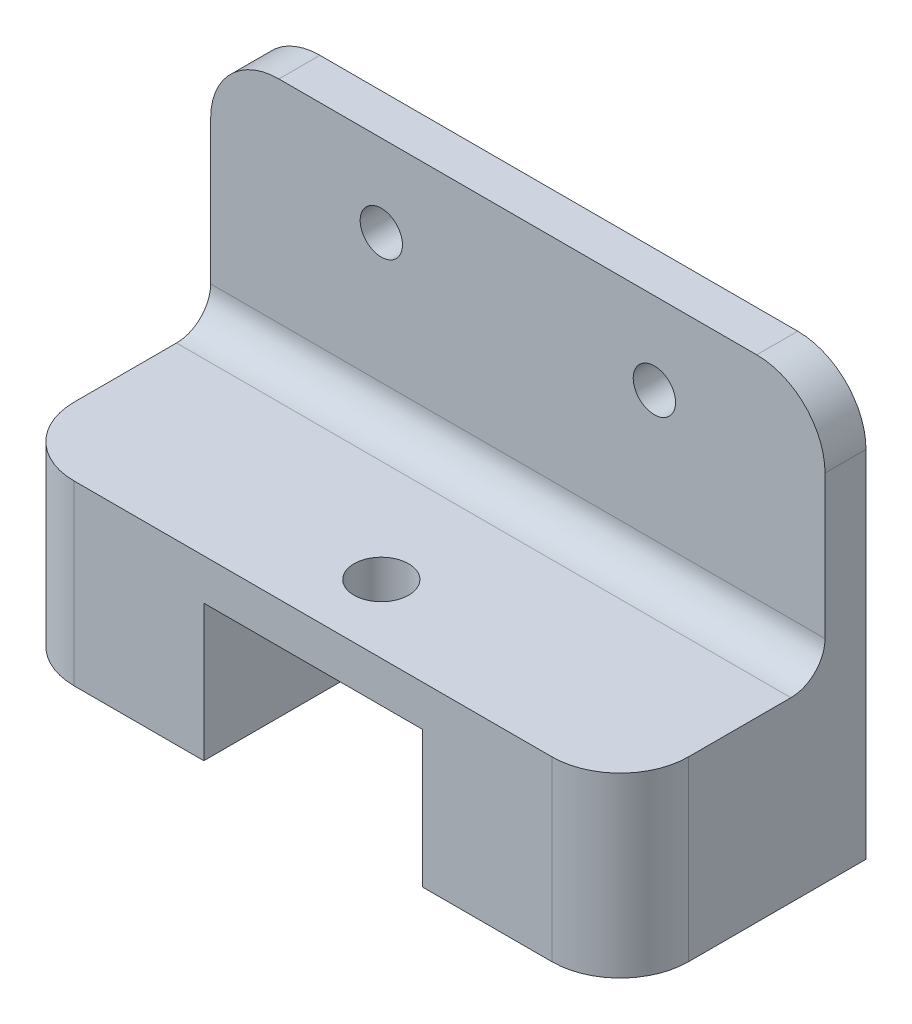
ISO-10303-21;
HEADER;
FILE_DESCRIPTION(('STEP AP214'),'2;1');
FILE_NAME('part.step','',(''),(''),'','','');
FILE_SCHEMA(('AUTOMOTIVE_DESIGN { 1 0 10303 214 1 1 1 1 }'));
ENDSEC;
DATA;
#1=APPLICATION_CONTEXT('core data for automotive mechanical design processes');
#2=APPLICATION_PROTOCOL_DEFINITION('international standard','automotive_design',2000,#1);
#3=PRODUCT_CONTEXT('',#1,'mechanical');
#4=PRODUCT('Part','Part','',(#3));
#5=PRODUCT_RELATED_PRODUCT_CATEGORY('part','',(#4));
#6=PRODUCT_DEFINITION_FORMATION('','',#4);
#7=PRODUCT_DEFINITION_CONTEXT('part definition',#1,'design');
#8=PRODUCT_DEFINITION('design','',#6,#7);
#9=PRODUCT_DEFINITION_SHAPE('','',#8);
#10=(LENGTH_UNIT() NAMED_UNIT(*) SI_UNIT(.MILLI.,.METRE.));
#11=(NAMED_UNIT(*) PLANE_ANGLE_UNIT() SI_UNIT($,.RADIAN.));
#12=(NAMED_UNIT(*) SI_UNIT($,.STERADIAN.) SOLID_ANGLE_UNIT());
#13=UNCERTAINTY_MEASURE_WITH_UNIT(LENGTH_MEASURE(1.E-05),#10,'distance_accuracy_value','');
#14=(GEOMETRIC_REPRESENTATION_CONTEXT(3) GLOBAL_UNCERTAINTY_ASSIGNED_CONTEXT((#13)) GLOBAL_UNIT_ASSIGNED_CONTEXT((#10,
#11,#12)) REPRESENTATION_CONTEXT('',''));
#15=CARTESIAN_POINT('',(0.,0.,0.));
#16=DIRECTION('',(0.,0.,1.));
#17=DIRECTION('',(1.,0.,0.));
#18=AXIS2_PLACEMENT_3D('',#15,#16,#17);
#19=CARTESIAN_POINT('',(0.,-11.5,0.));
#20=DIRECTION('',(0.,1.,0.));
#21=DIRECTION('',(0.,0.,1.));
#22=AXIS2_PLACEMENT_3D('',#19,#20,#21);
#23=PLANE('',#22);
#24=DIRECTION('',(-1.,0.,0.));
#25=VECTOR('',#24,1.);
#26=CARTESIAN_POINT('',(0.,-11.5,9.));
#27=LINE('',#26,#25);
#28=CARTESIAN_POINT('',(40.,-11.5,9.));
#29=VERTEX_POINT('',#28);
#30=CARTESIAN_POINT('',(30.5,-11.5,9.));
#31=VERTEX_POINT('',#30);
#32=EDGE_CURVE('E194',#29,#31,#27,.T.);
#33=ORIENTED_EDGE('',*,*,#32,.T.);
#34=DIRECTION('',(0.,0.,1.));
#35=VECTOR('',#34,1.);
#36=CARTESIAN_POINT('',(30.5,-11.5,-9.00000000000007));
#37=LINE('',#36,#35);
#38=CARTESIAN_POINT('',(30.5,-11.5,-9.00000000000007));
#39=VERTEX_POINT('',#38);
#40=EDGE_CURVE('E178',#39,#31,#37,.T.);
#41=ORIENTED_EDGE('',*,*,#40,.F.);
#42=DIRECTION('',(1.,0.,0.));
#43=VECTOR('',#42,1.);
#44=CARTESIAN_POINT('',(0.,-11.5,-9.));
#45=LINE('',#44,#43);
#46=CARTESIAN_POINT('',(45.,-11.5,-9.));
#47=VERTEX_POINT('',#46);
#48=EDGE_CURVE('E169',#39,#47,#45,.T.);
#49=ORIENTED_EDGE('',*,*,#48,.T.);
#50=DIRECTION('',(0.,0.,1.));
#51=VECTOR('',#50,1.);
#52=CARTESIAN_POINT('',(45.,-11.5,-9.));
#53=LINE('',#52,#51);
#54=CARTESIAN_POINT('',(45.,-11.5,4.));
#55=VERTEX_POINT('',#54);
#56=EDGE_CURVE('E190',#47,#55,#53,.T.);
#57=ORIENTED_EDGE('',*,*,#56,.T.);
#58=CARTESIAN_POINT('',(40.,-11.5,4.));
#59=DIRECTION('',(0.,1.,0.));
#60=DIRECTION('',(0.,0.,1.));
#61=AXIS2_PLACEMENT_3D('',#58,#59,#60);
#62=CIRCLE('',#61,5.);
#63=EDGE_CURVE('E253',#55,#29,#62,.F.);
#64=ORIENTED_EDGE('',*,*,#63,.T.);
#65=EDGE_LOOP('',(#33,#41,#49,#57,#64));
#66=FACE_BOUND('',#65,.T.);
#67=ADVANCED_FACE('F36',(#66),#23,.F.);
#68=CARTESIAN_POINT('',(45.,19.5,-9.));
#69=DIRECTION('',(0.,-1.,0.));
#70=DIRECTION('',(0.,0.,-1.));
#71=AXIS2_PLACEMENT_3D('',#68,#69,#70);
#72=PLANE('',#71);
#73=DIRECTION('',(-1.,0.,0.));
#74=VECTOR('',#73,1.);
#75=CARTESIAN_POINT('',(45.,19.5,-9.));
#76=LINE('',#75,#74);
#77=CARTESIAN_POINT('',(40.,19.5,-9.));
#78=VERTEX_POINT('',#77);
#79=CARTESIAN_POINT('',(5.00000000000001,19.5,-9.));
#80=VERTEX_POINT('',#79);
#81=EDGE_CURVE('E234',#78,#80,#76,.T.);
#82=ORIENTED_EDGE('',*,*,#81,.T.);
#83=DIRECTION('',(0.,0.,1.));
#84=VECTOR('',#83,1.);
#85=CARTESIAN_POINT('',(5.,19.5,-9.));
#86=LINE('',#85,#84);
#87=CARTESIAN_POINT('',(5.00000000000001,19.5,-6.));
#88=VERTEX_POINT('',#87);
#89=EDGE_CURVE('E268',#80,#88,#86,.T.);
#90=ORIENTED_EDGE('',*,*,#89,.T.);
#91=DIRECTION('',(-1.,0.,0.));
#92=VECTOR('',#91,1.);
#93=CARTESIAN_POINT('',(45.,19.5,-6.));
#94=LINE('',#93,#92);
#95=CARTESIAN_POINT('',(40.,19.5,-6.));
#96=VERTEX_POINT('',#95);
#97=EDGE_CURVE('E231',#96,#88,#94,.T.);
#98=ORIENTED_EDGE('',*,*,#97,.F.);
#99=DIRECTION('',(0.,0.,1.));
#100=VECTOR('',#99,1.);
#101=CARTESIAN_POINT('',(40.,19.5,-9.));
#102=LINE('',#101,#100);
#103=EDGE_CURVE('E266',#96,#78,#102,.F.);
#104=ORIENTED_EDGE('',*,*,#103,.T.);
#105=EDGE_LOOP('',(#82,#90,#98,#104));
#106=FACE_BOUND('',#105,.T.);
#107=ADVANCED_FACE('F281',(#106),#72,.F.);
#108=CARTESIAN_POINT('',(45.,1.5,-6.));
#109=DIRECTION('',(0.,0.,-1.));
#110=DIRECTION('',(-1.,0.,0.));
#111=AXIS2_PLACEMENT_3D('',#108,#109,#110);
#112=PLANE('',#111);
#113=CARTESIAN_POINT('',(32.5,13.5,-6.));
#114=DIRECTION('',(0.,0.,-1.));
#115=DIRECTION('',(-1.,0.,0.));
#116=AXIS2_PLACEMENT_3D('',#113,#114,#115);
#117=CIRCLE('',#116,1.55);
#118=CARTESIAN_POINT('',(30.95,13.5,-6.));
#119=VERTEX_POINT('',#118);
#120=EDGE_CURVE('E206',#119,#119,#117,.T.);
#121=ORIENTED_EDGE('',*,*,#120,.T.);
#122=EDGE_LOOP('',(#121));
#123=FACE_BOUND('',#122,.T.);
#124=CARTESIAN_POINT('',(12.5,13.5,-6.));
#125=DIRECTION('',(0.,0.,-1.));
#126=DIRECTION('',(-1.,0.,0.));
#127=AXIS2_PLACEMENT_3D('',#124,#125,#126);
#128=CIRCLE('',#127,1.55);
#129=CARTESIAN_POINT('',(10.95,13.5,-6.));
#130=VERTEX_POINT('',#129);
#131=EDGE_CURVE('E201',#130,#130,#128,.T.);
#132=ORIENTED_EDGE('',*,*,#131,.T.);
#133=EDGE_LOOP('',(#132));
#134=FACE_BOUND('',#133,.T.);
#135=ORIENTED_EDGE('',*,*,#97,.T.);
#136=CARTESIAN_POINT('',(5.,14.5,-6.));
#137=DIRECTION('',(0.,0.,-1.));
#138=DIRECTION('',(-1.,0.,0.));
#139=AXIS2_PLACEMENT_3D('',#136,#137,#138);
#140=CIRCLE('',#139,5.);
#141=CARTESIAN_POINT('',(0.,14.5,-6.));
#142=VERTEX_POINT('',#141);
#143=EDGE_CURVE('E273',#88,#142,#140,.F.);
#144=ORIENTED_EDGE('',*,*,#143,.T.);
#145=DIRECTION('',(0.,-1.,0.));
#146=VECTOR('',#145,1.);
#147=CARTESIAN_POINT('',(0.,1.5,-6.));
#148=LINE('',#147,#146);
#149=CARTESIAN_POINT('',(0.,4.,-6.));
#150=VERTEX_POINT('',#149);
#151=EDGE_CURVE('E214',#142,#150,#148,.T.);
#152=ORIENTED_EDGE('',*,*,#151,.T.);
#153=DIRECTION('',(-1.,0.,0.));
#154=VECTOR('',#153,1.);
#155=CARTESIAN_POINT('',(45.,4.,-6.));
#156=LINE('',#155,#154);
#157=CARTESIAN_POINT('',(45.,4.,-6.));
#158=VERTEX_POINT('',#157);
#159=EDGE_CURVE('E240',#150,#158,#156,.F.);
#160=ORIENTED_EDGE('',*,*,#159,.T.);
#161=DIRECTION('',(0.,-1.,0.));
#162=VECTOR('',#161,1.);
#163=CARTESIAN_POINT('',(45.,1.5,-6.));
#164=LINE('',#163,#162);
#165=CARTESIAN_POINT('',(45.,14.5,-6.));
#166=VERTEX_POINT('',#165);
#167=EDGE_CURVE('E217',#166,#158,#164,.T.);
#168=ORIENTED_EDGE('',*,*,#167,.F.);
#169=CARTESIAN_POINT('',(40.,14.5,-6.));
#170=DIRECTION('',(0.,0.,-1.));
#171=DIRECTION('',(-1.,0.,0.));
#172=AXIS2_PLACEMENT_3D('',#169,#170,#171);
#173=CIRCLE('',#172,5.);
#174=EDGE_CURVE('E271',#166,#96,#173,.F.);
#175=ORIENTED_EDGE('',*,*,#174,.T.);
#176=EDGE_LOOP('',(#135,#144,#152,#160,#168,#175));
#177=FACE_BOUND('',#176,.T.);
#178=ADVANCED_FACE('F286',(#123,#134,#177),#112,.F.);
#179=CARTESIAN_POINT('',(45.,1.5,9.));
#180=DIRECTION('',(0.,-1.,0.));
#181=DIRECTION('',(0.,0.,-1.));
#182=AXIS2_PLACEMENT_3D('',#179,#180,#181);
#183=PLANE('',#182);
#184=CARTESIAN_POINT('',(22.5,1.5,4.));
#185=DIRECTION('',(0.,1.,0.));
#186=DIRECTION('',(0.,0.,1.));
#187=AXIS2_PLACEMENT_3D('',#184,#185,#186);
#188=CIRCLE('',#187,2.);
#189=CARTESIAN_POINT('',(22.5,1.5,6.));
#190=VERTEX_POINT('',#189);
#191=EDGE_CURVE('E209',#190,#190,#188,.T.);
#192=ORIENTED_EDGE('',*,*,#191,.F.);
#193=EDGE_LOOP('',(#192));
#194=FACE_BOUND('',#193,.T.);
#195=DIRECTION('',(-1.,0.,0.));
#196=VECTOR('',#195,1.);
#197=CARTESIAN_POINT('',(45.,1.5,9.));
#198=LINE('',#197,#196);
#199=CARTESIAN_POINT('',(40.,1.5,9.));
#200=VERTEX_POINT('',#199);
#201=CARTESIAN_POINT('',(5.00000000000001,1.5,9.));
#202=VERTEX_POINT('',#201);
#203=EDGE_CURVE('E223',#200,#202,#198,.T.);
#204=ORIENTED_EDGE('',*,*,#203,.F.);
#205=CARTESIAN_POINT('',(40.,1.5,4.));
#206=DIRECTION('',(0.,-1.,0.));
#207=DIRECTION('',(0.,0.,-1.));
#208=AXIS2_PLACEMENT_3D('',#205,#206,#207);
#209=CIRCLE('',#208,5.);
#210=CARTESIAN_POINT('',(45.,1.5,4.));
#211=VERTEX_POINT('',#210);
#212=EDGE_CURVE('E262',#200,#211,#209,.F.);
#213=ORIENTED_EDGE('',*,*,#212,.T.);
#214=DIRECTION('',(0.,0.,1.));
#215=VECTOR('',#214,1.);
#216=CARTESIAN_POINT('',(45.,1.5,9.));
#217=LINE('',#216,#215);
#218=CARTESIAN_POINT('',(45.,1.5,-3.5));
#219=VERTEX_POINT('',#218);
#220=EDGE_CURVE('E220',#219,#211,#217,.T.);
#221=ORIENTED_EDGE('',*,*,#220,.F.);
#222=DIRECTION('',(-1.,0.,0.));
#223=VECTOR('',#222,1.);
#224=CARTESIAN_POINT('',(0.,1.5,-3.5));
#225=LINE('',#224,#223);
#226=CARTESIAN_POINT('',(0.,1.5,-3.5));
#227=VERTEX_POINT('',#226);
#228=EDGE_CURVE('E237',#219,#227,#225,.T.);
#229=ORIENTED_EDGE('',*,*,#228,.T.);
#230=DIRECTION('',(0.,0.,1.));
#231=VECTOR('',#230,1.);
#232=CARTESIAN_POINT('',(0.,1.5,9.));
#233=LINE('',#232,#231);
#234=CARTESIAN_POINT('',(0.,1.5,4.));
#235=VERTEX_POINT('',#234);
#236=EDGE_CURVE('E225',#227,#235,#233,.T.);
#237=ORIENTED_EDGE('',*,*,#236,.T.);
#238=CARTESIAN_POINT('',(5.,1.5,4.));
#239=DIRECTION('',(0.,-1.,0.));
#240=DIRECTION('',(0.,0.,-1.));
#241=AXIS2_PLACEMENT_3D('',#238,#239,#240);
#242=CIRCLE('',#241,5.);
#243=EDGE_CURVE('E260',#235,#202,#242,.F.);
#244=ORIENTED_EDGE('',*,*,#243,.T.);
#245=EDGE_LOOP('',(#204,#213,#221,#229,#237,#244));
#246=FACE_BOUND('',#245,.T.);
#247=ADVANCED_FACE('F342',(#194,#246),#183,.F.);
#248=CARTESIAN_POINT('',(45.,-1.5,9.));
#249=DIRECTION('',(0.,0.,-1.));
#250=DIRECTION('',(-1.,0.,0.));
#251=AXIS2_PLACEMENT_3D('',#248,#249,#250);
#252=PLANE('',#251);
#253=DIRECTION('',(-1.,0.,0.));
#254=VECTOR('',#253,1.);
#255=CARTESIAN_POINT('',(14.5,-1.5,9.));
#256=LINE('',#255,#254);
#257=CARTESIAN_POINT('',(30.5,-1.5,9.));
#258=VERTEX_POINT('',#257);
#259=CARTESIAN_POINT('',(14.5,-1.5,9.));
#260=VERTEX_POINT('',#259);
#261=EDGE_CURVE('E172',#258,#260,#256,.T.);
#262=ORIENTED_EDGE('',*,*,#261,.F.);
#263=DIRECTION('',(0.,1.,0.));
#264=VECTOR('',#263,1.);
#265=CARTESIAN_POINT('',(30.5,-1.5,9.));
#266=LINE('',#265,#264);
#267=EDGE_CURVE('E153',#31,#258,#266,.T.);
#268=ORIENTED_EDGE('',*,*,#267,.F.);
#269=ORIENTED_EDGE('',*,*,#32,.F.);
#270=DIRECTION('',(0.,-1.,0.));
#271=VECTOR('',#270,1.);
#272=CARTESIAN_POINT('',(40.,1.5,9.));
#273=LINE('',#272,#271);
#274=EDGE_CURVE('E258',#29,#200,#273,.F.);
#275=ORIENTED_EDGE('',*,*,#274,.T.);
#276=ORIENTED_EDGE('',*,*,#203,.T.);
#277=DIRECTION('',(0.,-1.,0.));
#278=VECTOR('',#277,1.);
#279=CARTESIAN_POINT('',(5.,-1.5,9.));
#280=LINE('',#279,#278);
#281=CARTESIAN_POINT('',(5.,-11.5,9.));
#282=VERTEX_POINT('',#281);
#283=EDGE_CURVE('E255',#202,#282,#280,.T.);
#284=ORIENTED_EDGE('',*,*,#283,.T.);
#285=CARTESIAN_POINT('',(14.5,-11.5,9.));
#286=VERTEX_POINT('',#285);
#287=EDGE_CURVE('E193',#286,#282,#27,.T.);
#288=ORIENTED_EDGE('',*,*,#287,.F.);
#289=DIRECTION('',(0.,-1.,0.));
#290=VECTOR('',#289,1.);
#291=CARTESIAN_POINT('',(14.5,-1.5,9.));
#292=LINE('',#291,#290);
#293=EDGE_CURVE('E170',#260,#286,#292,.T.);
#294=ORIENTED_EDGE('',*,*,#293,.F.);
#295=EDGE_LOOP('',(#262,#268,#269,#275,#276,#284,#288,#294));
#296=FACE_BOUND('',#295,.T.);
#297=ADVANCED_FACE('F334',(#296),#252,.F.);
#298=CARTESIAN_POINT('',(45.,-1.5,-9.));
#299=DIRECTION('',(0.,0.,1.));
#300=DIRECTION('',(1.,0.,0.));
#301=AXIS2_PLACEMENT_3D('',#298,#299,#300);
#302=PLANE('',#301);
#303=DIRECTION('',(0.,1.,0.));
#304=VECTOR('',#303,1.);
#305=CARTESIAN_POINT('',(0.,-1.5,-9.));
#306=LINE('',#305,#304);
#307=CARTESIAN_POINT('',(0.,-11.5,-9.));
#308=VERTEX_POINT('',#307);
#309=CARTESIAN_POINT('',(0.,14.5,-9.));
#310=VERTEX_POINT('',#309);
#311=EDGE_CURVE('E218',#308,#310,#306,.T.);
#312=ORIENTED_EDGE('',*,*,#311,.T.);
#313=CARTESIAN_POINT('',(5.,14.5,-9.));
#314=DIRECTION('',(0.,0.,1.));
#315=DIRECTION('',(1.,0.,0.));
#316=AXIS2_PLACEMENT_3D('',#313,#314,#315);
#317=CIRCLE('',#316,5.);
#318=EDGE_CURVE('E44',#310,#80,#317,.F.);
#319=ORIENTED_EDGE('',*,*,#318,.T.);
#320=ORIENTED_EDGE('',*,*,#81,.F.);
#321=CARTESIAN_POINT('',(40.,14.5,-9.));
#322=DIRECTION('',(0.,0.,1.));
#323=DIRECTION('',(1.,0.,0.));
#324=AXIS2_PLACEMENT_3D('',#321,#322,#323);
#325=CIRCLE('',#324,5.);
#326=CARTESIAN_POINT('',(45.,14.5,-9.));
#327=VERTEX_POINT('',#326);
#328=EDGE_CURVE('E51',#78,#327,#325,.F.);
#329=ORIENTED_EDGE('',*,*,#328,.T.);
#330=DIRECTION('',(0.,1.,0.));
#331=VECTOR('',#330,1.);
#332=CARTESIAN_POINT('',(45.,1.5,-9.));
#333=LINE('',#332,#331);
#334=EDGE_CURVE('E215',#47,#327,#333,.T.);
#335=ORIENTED_EDGE('',*,*,#334,.F.);
#336=ORIENTED_EDGE('',*,*,#48,.F.);
#337=DIRECTION('',(0.,1.,0.));
#338=VECTOR('',#337,1.);
#339=CARTESIAN_POINT('',(30.5,-1.5,-9.00000000000007));
#340=LINE('',#339,#338);
#341=CARTESIAN_POINT('',(30.5,-1.5,-9.00000000000007));
#342=VERTEX_POINT('',#341);
#343=EDGE_CURVE('E150',#39,#342,#340,.T.);
#344=ORIENTED_EDGE('',*,*,#343,.T.);
#345=DIRECTION('',(-1.,0.,0.));
#346=VECTOR('',#345,1.);
#347=CARTESIAN_POINT('',(14.5,-1.5,-9.00000000000007));
#348=LINE('',#347,#346);
#349=CARTESIAN_POINT('',(14.5,-1.5,-9.00000000000007));
#350=VERTEX_POINT('',#349);
#351=EDGE_CURVE('E161',#342,#350,#348,.T.);
#352=ORIENTED_EDGE('',*,*,#351,.T.);
#353=DIRECTION('',(0.,-1.,0.));
#354=VECTOR('',#353,1.);
#355=CARTESIAN_POINT('',(14.5,-1.5,-9.00000000000007));
#356=LINE('',#355,#354);
#357=CARTESIAN_POINT('',(14.5,-11.5,-9.00000000000007));
#358=VERTEX_POINT('',#357);
#359=EDGE_CURVE('E158',#350,#358,#356,.T.);
#360=ORIENTED_EDGE('',*,*,#359,.T.);
#361=EDGE_CURVE('E187',#308,#358,#45,.T.);
#362=ORIENTED_EDGE('',*,*,#361,.F.);
#363=EDGE_LOOP('',(#312,#319,#320,#329,#335,#336,#344,#352,#360,#362));
#364=FACE_BOUND('',#363,.T.);
#365=CARTESIAN_POINT('',(32.5,13.5,-9.00000000000006));
#366=DIRECTION('',(0.,0.,-1.));
#367=DIRECTION('',(0.,1.,0.));
#368=AXIS2_PLACEMENT_3D('',#365,#366,#367);
#369=CIRCLE('',#368,1.55);
#370=CARTESIAN_POINT('',(32.5,15.05,-9.00000000000007));
#371=VERTEX_POINT('',#370);
#372=EDGE_CURVE('E198',#371,#371,#369,.T.);
#373=ORIENTED_EDGE('',*,*,#372,.F.);
#374=EDGE_LOOP('',(#373));
#375=FACE_BOUND('',#374,.T.);
#376=CARTESIAN_POINT('',(12.5,13.5,-9.00000000000006));
#377=DIRECTION('',(0.,0.,-1.));
#378=DIRECTION('',(0.,-1.,0.));
#379=AXIS2_PLACEMENT_3D('',#376,#377,#378);
#380=CIRCLE('',#379,1.55);
#381=CARTESIAN_POINT('',(12.5,11.95,-9.00000000000006));
#382=VERTEX_POINT('',#381);
#383=EDGE_CURVE('E197',#382,#382,#380,.T.);
#384=ORIENTED_EDGE('',*,*,#383,.F.);
#385=EDGE_LOOP('',(#384));
#386=FACE_BOUND('',#385,.T.);
#387=ADVANCED_FACE('F167',(#364,#375,#386),#302,.F.);
#388=CARTESIAN_POINT('',(45.,0.,0.));
#389=DIRECTION('',(1.,0.,0.));
#390=DIRECTION('',(0.,0.,-1.));
#391=AXIS2_PLACEMENT_3D('',#388,#389,#390);
#392=PLANE('',#391);
#393=ORIENTED_EDGE('',*,*,#334,.T.);
#394=DIRECTION('',(0.,0.,1.));
#395=VECTOR('',#394,1.);
#396=CARTESIAN_POINT('',(45.,14.5,-6.));
#397=LINE('',#396,#395);
#398=EDGE_CURVE('E11',#327,#166,#397,.T.);
#399=ORIENTED_EDGE('',*,*,#398,.T.);
#400=ORIENTED_EDGE('',*,*,#167,.T.);
#401=CARTESIAN_POINT('',(45.,4.,-3.5));
#402=DIRECTION('',(1.,0.,0.));
#403=DIRECTION('',(0.,0.,-1.));
#404=AXIS2_PLACEMENT_3D('',#401,#402,#403);
#405=CIRCLE('',#404,2.5);
#406=EDGE_CURVE('E246',#158,#219,#405,.F.);
#407=ORIENTED_EDGE('',*,*,#406,.T.);
#408=ORIENTED_EDGE('',*,*,#220,.T.);
#409=DIRECTION('',(0.,-1.,0.));
#410=VECTOR('',#409,1.);
#411=CARTESIAN_POINT('',(45.,-11.5,4.));
#412=LINE('',#411,#410);
#413=EDGE_CURVE('E248',#211,#55,#412,.T.);
#414=ORIENTED_EDGE('',*,*,#413,.T.);
#415=ORIENTED_EDGE('',*,*,#56,.F.);
#416=EDGE_LOOP('',(#393,#399,#400,#407,#408,#414,#415));
#417=FACE_BOUND('',#416,.T.);
#418=ADVANCED_FACE('F296',(#417),#392,.T.);
#419=CARTESIAN_POINT('',(0.,0.,0.));
#420=DIRECTION('',(1.,0.,0.));
#421=DIRECTION('',(0.,0.,-1.));
#422=AXIS2_PLACEMENT_3D('',#419,#420,#421);
#423=PLANE('',#422);
#424=ORIENTED_EDGE('',*,*,#151,.F.);
#425=DIRECTION('',(0.,0.,1.));
#426=VECTOR('',#425,1.);
#427=CARTESIAN_POINT('',(0.,14.5,0.));
#428=LINE('',#427,#426);
#429=EDGE_CURVE('E59',#142,#310,#428,.F.);
#430=ORIENTED_EDGE('',*,*,#429,.T.);
#431=ORIENTED_EDGE('',*,*,#311,.F.);
#432=DIRECTION('',(0.,0.,-1.));
#433=VECTOR('',#432,1.);
#434=CARTESIAN_POINT('',(0.,-11.5,-9.));
#435=LINE('',#434,#433);
#436=CARTESIAN_POINT('',(0.,-11.5,4.));
#437=VERTEX_POINT('',#436);
#438=EDGE_CURVE('E185',#437,#308,#435,.T.);
#439=ORIENTED_EDGE('',*,*,#438,.F.);
#440=DIRECTION('',(0.,-1.,0.));
#441=VECTOR('',#440,1.);
#442=CARTESIAN_POINT('',(0.,0.,4.));
#443=LINE('',#442,#441);
#444=EDGE_CURVE('E264',#437,#235,#443,.F.);
#445=ORIENTED_EDGE('',*,*,#444,.T.);
#446=ORIENTED_EDGE('',*,*,#236,.F.);
#447=CARTESIAN_POINT('',(0.,4.,-3.5));
#448=DIRECTION('',(1.,0.,0.));
#449=DIRECTION('',(0.,0.,-1.));
#450=AXIS2_PLACEMENT_3D('',#447,#448,#449);
#451=CIRCLE('',#450,2.5);
#452=EDGE_CURVE('E243',#227,#150,#451,.T.);
#453=ORIENTED_EDGE('',*,*,#452,.T.);
#454=EDGE_LOOP('',(#424,#430,#431,#439,#445,#446,#453));
#455=FACE_BOUND('',#454,.T.);
#456=ADVANCED_FACE('F287',(#455),#423,.F.);
#457=CARTESIAN_POINT('',(45.,4.,-3.5));
#458=DIRECTION('',(1.,0.,0.));
#459=DIRECTION('',(0.,0.,-1.));
#460=AXIS2_PLACEMENT_3D('',#457,#458,#459);
#461=CYLINDRICAL_SURFACE('',#460,2.5);
#462=ORIENTED_EDGE('',*,*,#406,.F.);
#463=ORIENTED_EDGE('',*,*,#159,.F.);
#464=ORIENTED_EDGE('',*,*,#452,.F.);
#465=ORIENTED_EDGE('',*,*,#228,.F.);
#466=EDGE_LOOP('',(#462,#463,#464,#465));
#467=FACE_BOUND('',#466,.T.);
#468=ADVANCED_FACE('F293',(#467),#461,.F.);
#469=CARTESIAN_POINT('',(22.5,-1.5,4.));
#470=DIRECTION('',(0.,1.,0.));
#471=DIRECTION('',(0.,0.,1.));
#472=AXIS2_PLACEMENT_3D('',#469,#470,#471);
#473=CYLINDRICAL_SURFACE('',#472,2.);
#474=CARTESIAN_POINT('',(22.5,-1.5,4.));
#475=DIRECTION('',(0.,1.,0.));
#476=DIRECTION('',(0.,0.,1.));
#477=AXIS2_PLACEMENT_3D('',#474,#475,#476);
#478=CIRCLE('',#477,2.);
#479=CARTESIAN_POINT('',(22.5,-1.5,6.));
#480=VERTEX_POINT('',#479);
#481=EDGE_CURVE('E180',#480,#480,#478,.T.);
#482=ORIENTED_EDGE('',*,*,#481,.F.);
#483=EDGE_LOOP('',(#482));
#484=FACE_BOUND('',#483,.T.);
#485=ORIENTED_EDGE('',*,*,#191,.T.);
#486=EDGE_LOOP('',(#485));
#487=FACE_BOUND('',#486,.T.);
#488=ADVANCED_FACE('F361',(#484,#487),#473,.F.);
#489=CARTESIAN_POINT('',(12.5,13.5000000000001,9.00000000000002));
#490=DIRECTION('',(0.,0.,-1.));
#491=DIRECTION('',(0.,1.,0.));
#492=AXIS2_PLACEMENT_3D('',#489,#490,#491);
#493=CYLINDRICAL_SURFACE('',#492,1.55);
#494=ORIENTED_EDGE('',*,*,#383,.T.);
#495=EDGE_LOOP('',(#494));
#496=FACE_BOUND('',#495,.T.);
#497=ORIENTED_EDGE('',*,*,#131,.F.);
#498=EDGE_LOOP('',(#497));
#499=FACE_BOUND('',#498,.T.);
#500=ADVANCED_FACE('F326',(#496,#499),#493,.F.);
#501=CARTESIAN_POINT('',(32.5,13.5000000000001,9.00000000000002));
#502=DIRECTION('',(0.,0.,-1.));
#503=DIRECTION('',(0.,1.,0.));
#504=AXIS2_PLACEMENT_3D('',#501,#502,#503);
#505=CYLINDRICAL_SURFACE('',#504,1.55);
#506=ORIENTED_EDGE('',*,*,#372,.T.);
#507=EDGE_LOOP('',(#506));
#508=FACE_BOUND('',#507,.T.);
#509=ORIENTED_EDGE('',*,*,#120,.F.);
#510=EDGE_LOOP('',(#509));
#511=FACE_BOUND('',#510,.T.);
#512=ADVANCED_FACE('F317',(#508,#511),#505,.F.);
#513=ORIENTED_EDGE('',*,*,#361,.T.);
#514=DIRECTION('',(0.,0.,1.));
#515=VECTOR('',#514,1.);
#516=CARTESIAN_POINT('',(14.5,-11.5,-9.00000000000007));
#517=LINE('',#516,#515);
#518=EDGE_CURVE('E181',#358,#286,#517,.T.);
#519=ORIENTED_EDGE('',*,*,#518,.T.);
#520=ORIENTED_EDGE('',*,*,#287,.T.);
#521=CARTESIAN_POINT('',(5.,-11.5,4.));
#522=DIRECTION('',(0.,1.,0.));
#523=DIRECTION('',(0.,0.,1.));
#524=AXIS2_PLACEMENT_3D('',#521,#522,#523);
#525=CIRCLE('',#524,5.);
#526=EDGE_CURVE('E251',#282,#437,#525,.F.);
#527=ORIENTED_EDGE('',*,*,#526,.T.);
#528=ORIENTED_EDGE('',*,*,#438,.T.);
#529=EDGE_LOOP('',(#513,#519,#520,#527,#528));
#530=FACE_BOUND('',#529,.T.);
#531=ADVANCED_FACE('F308',(#530),#23,.F.);
#532=CARTESIAN_POINT('',(40.,0.,4.));
#533=DIRECTION('',(0.,1.,0.));
#534=DIRECTION('',(0.,0.,1.));
#535=AXIS2_PLACEMENT_3D('',#532,#533,#534);
#536=CYLINDRICAL_SURFACE('',#535,5.);
#537=ORIENTED_EDGE('',*,*,#212,.F.);
#538=ORIENTED_EDGE('',*,*,#274,.F.);
#539=ORIENTED_EDGE('',*,*,#63,.F.);
#540=ORIENTED_EDGE('',*,*,#413,.F.);
#541=EDGE_LOOP('',(#537,#538,#539,#540));
#542=FACE_BOUND('',#541,.T.);
#543=ADVANCED_FACE('F316',(#542),#536,.T.);
#544=CARTESIAN_POINT('',(5.,-1.5,4.));
#545=DIRECTION('',(0.,-1.,0.));
#546=DIRECTION('',(0.,0.,-1.));
#547=AXIS2_PLACEMENT_3D('',#544,#545,#546);
#548=CYLINDRICAL_SURFACE('',#547,5.);
#549=ORIENTED_EDGE('',*,*,#243,.F.);
#550=ORIENTED_EDGE('',*,*,#444,.F.);
#551=ORIENTED_EDGE('',*,*,#526,.F.);
#552=ORIENTED_EDGE('',*,*,#283,.F.);
#553=EDGE_LOOP('',(#549,#550,#551,#552));
#554=FACE_BOUND('',#553,.T.);
#555=ADVANCED_FACE('F323',(#554),#548,.T.);
#556=CARTESIAN_POINT('',(30.5,-1.5,-9.00000000000007));
#557=DIRECTION('',(1.,0.,0.));
#558=DIRECTION('',(0.,0.,-1.));
#559=AXIS2_PLACEMENT_3D('',#556,#557,#558);
#560=PLANE('',#559);
#561=ORIENTED_EDGE('',*,*,#267,.T.);
#562=DIRECTION('',(0.,0.,1.));
#563=VECTOR('',#562,1.);
#564=CARTESIAN_POINT('',(30.5,-1.5,-9.00000000000007));
#565=LINE('',#564,#563);
#566=EDGE_CURVE('E146',#342,#258,#565,.T.);
#567=ORIENTED_EDGE('',*,*,#566,.F.);
#568=ORIENTED_EDGE('',*,*,#343,.F.);
#569=ORIENTED_EDGE('',*,*,#40,.T.);
#570=EDGE_LOOP('',(#561,#567,#568,#569));
#571=FACE_BOUND('',#570,.T.);
#572=ADVANCED_FACE('F148',(#571),#560,.F.);
#573=CARTESIAN_POINT('',(14.5,-1.5,-9.00000000000007));
#574=DIRECTION('',(-1.,0.,0.));
#575=DIRECTION('',(0.,-1.,0.));
#576=AXIS2_PLACEMENT_3D('',#573,#574,#575);
#577=PLANE('',#576);
#578=ORIENTED_EDGE('',*,*,#293,.T.);
#579=ORIENTED_EDGE('',*,*,#518,.F.);
#580=ORIENTED_EDGE('',*,*,#359,.F.);
#581=DIRECTION('',(0.,0.,1.));
#582=VECTOR('',#581,1.);
#583=CARTESIAN_POINT('',(14.5,-1.5,-9.00000000000007));
#584=LINE('',#583,#582);
#585=EDGE_CURVE('E157',#350,#260,#584,.T.);
#586=ORIENTED_EDGE('',*,*,#585,.T.);
#587=EDGE_LOOP('',(#578,#579,#580,#586));
#588=FACE_BOUND('',#587,.T.);
#589=ADVANCED_FACE('F331',(#588),#577,.F.);
#590=CARTESIAN_POINT('',(14.5,-1.5,-9.00000000000007));
#591=DIRECTION('',(0.,1.,0.));
#592=DIRECTION('',(0.,0.,1.));
#593=AXIS2_PLACEMENT_3D('',#590,#591,#592);
#594=PLANE('',#593);
#595=ORIENTED_EDGE('',*,*,#481,.T.);
#596=EDGE_LOOP('',(#595));
#597=FACE_BOUND('',#596,.T.);
#598=ORIENTED_EDGE('',*,*,#261,.T.);
#599=ORIENTED_EDGE('',*,*,#585,.F.);
#600=ORIENTED_EDGE('',*,*,#351,.F.);
#601=ORIENTED_EDGE('',*,*,#566,.T.);
#602=EDGE_LOOP('',(#598,#599,#600,#601));
#603=FACE_BOUND('',#602,.T.);
#604=ADVANCED_FACE('F162',(#597,#603),#594,.F.);
#605=CARTESIAN_POINT('',(5.,14.5,-9.));
#606=DIRECTION('',(0.,0.,1.));
#607=DIRECTION('',(1.,0.,0.));
#608=AXIS2_PLACEMENT_3D('',#605,#606,#607);
#609=CYLINDRICAL_SURFACE('',#608,5.);
#610=ORIENTED_EDGE('',*,*,#318,.F.);
#611=ORIENTED_EDGE('',*,*,#429,.F.);
#612=ORIENTED_EDGE('',*,*,#143,.F.);
#613=ORIENTED_EDGE('',*,*,#89,.F.);
#614=EDGE_LOOP('',(#610,#611,#612,#613));
#615=FACE_BOUND('',#614,.T.);
#616=ADVANCED_FACE('F284',(#615),#609,.T.);
#617=CARTESIAN_POINT('',(40.,14.5,0.));
#618=DIRECTION('',(0.,0.,-1.));
#619=DIRECTION('',(-1.,0.,0.));
#620=AXIS2_PLACEMENT_3D('',#617,#618,#619);
#621=CYLINDRICAL_SURFACE('',#620,5.);
#622=ORIENTED_EDGE('',*,*,#328,.F.);
#623=ORIENTED_EDGE('',*,*,#103,.F.);
#624=ORIENTED_EDGE('',*,*,#174,.F.);
#625=ORIENTED_EDGE('',*,*,#398,.F.);
#626=EDGE_LOOP('',(#622,#623,#624,#625));
#627=FACE_BOUND('',#626,.T.);
#628=ADVANCED_FACE('F38',(#627),#621,.T.);
#629=CLOSED_SHELL('',(#67,#107,#178,#247,#297,#387,#418,#456,#468,#488,#500,#512,#531,#543,#555,
#572,#589,#604,#616,#628));
#630=MANIFOLD_SOLID_BREP('B2',#629);
#631=ADVANCED_BREP_SHAPE_REPRESENTATION('',(#18,#630),#14);
#632=SHAPE_DEFINITION_REPRESENTATION(#9,#631);
ENDSEC;
END-ISO-10303-21;
